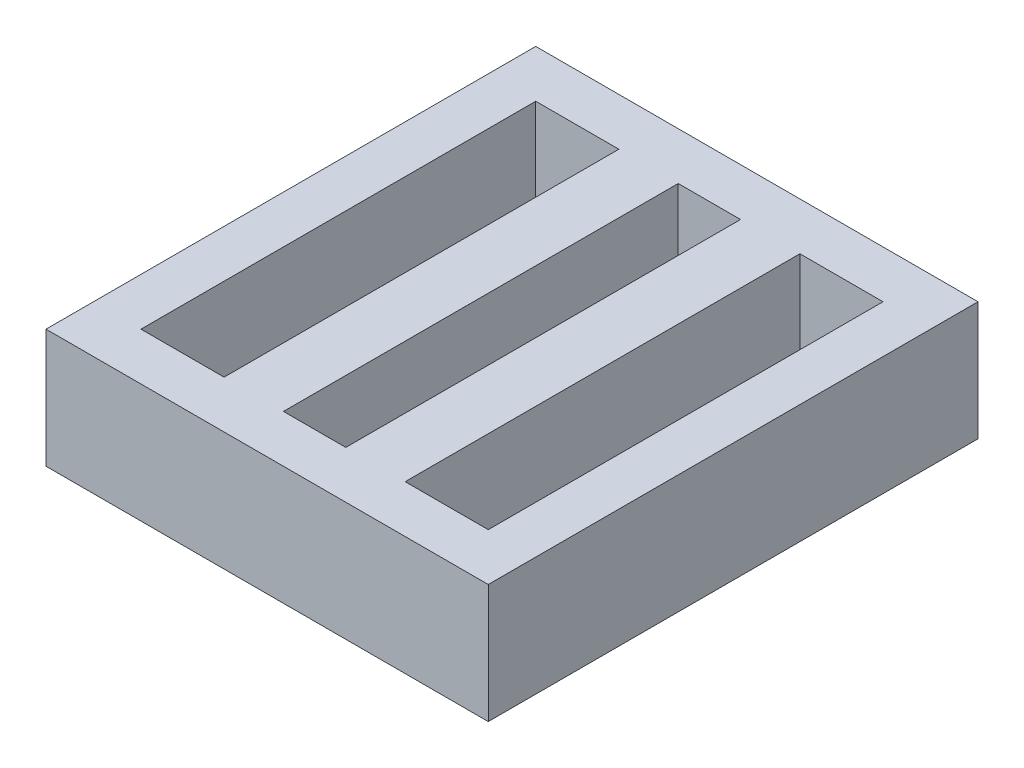
ISO-10303-21;
HEADER;
FILE_DESCRIPTION(('STEP AP214'),'2;1');
FILE_NAME('part.step','',(''),(''),'','','');
FILE_SCHEMA(('AUTOMOTIVE_DESIGN { 1 0 10303 214 1 1 1 1 }'));
ENDSEC;
DATA;
#1=APPLICATION_CONTEXT('core data for automotive mechanical design processes');
#2=APPLICATION_PROTOCOL_DEFINITION('international standard','automotive_design',2000,#1);
#3=PRODUCT_CONTEXT('',#1,'mechanical');
#4=PRODUCT('Part','Part','',(#3));
#5=PRODUCT_RELATED_PRODUCT_CATEGORY('part','',(#4));
#6=PRODUCT_DEFINITION_FORMATION('','',#4);
#7=PRODUCT_DEFINITION_CONTEXT('part definition',#1,'design');
#8=PRODUCT_DEFINITION('design','',#6,#7);
#9=PRODUCT_DEFINITION_SHAPE('','',#8);
#10=(LENGTH_UNIT() NAMED_UNIT(*) SI_UNIT(.MILLI.,.METRE.));
#11=(NAMED_UNIT(*) PLANE_ANGLE_UNIT() SI_UNIT($,.RADIAN.));
#12=(NAMED_UNIT(*) SI_UNIT($,.STERADIAN.) SOLID_ANGLE_UNIT());
#13=UNCERTAINTY_MEASURE_WITH_UNIT(LENGTH_MEASURE(1.E-05),#10,'distance_accuracy_value','');
#14=(GEOMETRIC_REPRESENTATION_CONTEXT(3) GLOBAL_UNCERTAINTY_ASSIGNED_CONTEXT((#13)) GLOBAL_UNIT_ASSIGNED_CONTEXT((#10,
#11,#12)) REPRESENTATION_CONTEXT('',''));
#15=CARTESIAN_POINT('',(0.,0.,0.));
#16=DIRECTION('',(0.,0.,1.));
#17=DIRECTION('',(1.,0.,0.));
#18=AXIS2_PLACEMENT_3D('',#15,#16,#17);
#19=CARTESIAN_POINT('',(0.,200.,0.));
#20=DIRECTION('',(0.,-1.,0.));
#21=DIRECTION('',(0.,0.,-1.));
#22=AXIS2_PLACEMENT_3D('',#19,#20,#21);
#23=PLANE('',#22);
#24=DIRECTION('',(0.,0.,-1.));
#25=VECTOR('',#24,1.);
#26=CARTESIAN_POINT('',(292.5,200.,-332.5));
#27=LINE('',#26,#25);
#28=CARTESIAN_POINT('',(292.5,200.,332.5));
#29=VERTEX_POINT('',#28);
#30=CARTESIAN_POINT('',(292.5,200.,-332.5));
#31=VERTEX_POINT('',#30);
#32=EDGE_CURVE('E209',#29,#31,#27,.T.);
#33=ORIENTED_EDGE('',*,*,#32,.F.);
#34=DIRECTION('',(1.,0.,0.));
#35=VECTOR('',#34,1.);
#36=CARTESIAN_POINT('',(292.5,200.,332.5));
#37=LINE('',#36,#35);
#38=CARTESIAN_POINT('',(152.5,200.,332.5));
#39=VERTEX_POINT('',#38);
#40=EDGE_CURVE('E216',#39,#29,#37,.T.);
#41=ORIENTED_EDGE('',*,*,#40,.F.);
#42=DIRECTION('',(0.,0.,1.));
#43=VECTOR('',#42,1.);
#44=CARTESIAN_POINT('',(152.5,200.,332.5));
#45=LINE('',#44,#43);
#46=CARTESIAN_POINT('',(152.5,200.,-332.5));
#47=VERTEX_POINT('',#46);
#48=EDGE_CURVE('E215',#47,#39,#45,.T.);
#49=ORIENTED_EDGE('',*,*,#48,.F.);
#50=DIRECTION('',(-1.,0.,0.));
#51=VECTOR('',#50,1.);
#52=CARTESIAN_POINT('',(292.5,200.,-332.5));
#53=LINE('',#52,#51);
#54=EDGE_CURVE('E208',#31,#47,#53,.T.);
#55=ORIENTED_EDGE('',*,*,#54,.F.);
#56=EDGE_LOOP('',(#33,#41,#49,#55));
#57=FACE_BOUND('',#56,.T.);
#58=DIRECTION('',(0.,0.,1.));
#59=VECTOR('',#58,1.);
#60=CARTESIAN_POINT('',(-372.5,200.,-412.5));
#61=LINE('',#60,#59);
#62=CARTESIAN_POINT('',(-372.5,200.,-412.5));
#63=VERTEX_POINT('',#62);
#64=CARTESIAN_POINT('',(-372.5,200.,412.5));
#65=VERTEX_POINT('',#64);
#66=EDGE_CURVE('E291',#63,#65,#61,.T.);
#67=ORIENTED_EDGE('',*,*,#66,.T.);
#68=DIRECTION('',(1.,0.,0.));
#69=VECTOR('',#68,1.);
#70=CARTESIAN_POINT('',(372.5,200.,412.5));
#71=LINE('',#70,#69);
#72=CARTESIAN_POINT('',(372.5,200.,412.5));
#73=VERTEX_POINT('',#72);
#74=EDGE_CURVE('E299',#65,#73,#71,.T.);
#75=ORIENTED_EDGE('',*,*,#74,.T.);
#76=DIRECTION('',(0.,0.,-1.));
#77=VECTOR('',#76,1.);
#78=CARTESIAN_POINT('',(372.5,200.,-412.5));
#79=LINE('',#78,#77);
#80=CARTESIAN_POINT('',(372.5,200.,-412.5));
#81=VERTEX_POINT('',#80);
#82=EDGE_CURVE('E303',#73,#81,#79,.T.);
#83=ORIENTED_EDGE('',*,*,#82,.T.);
#84=DIRECTION('',(-1.,0.,0.));
#85=VECTOR('',#84,1.);
#86=CARTESIAN_POINT('',(372.5,200.,-412.5));
#87=LINE('',#86,#85);
#88=EDGE_CURVE('E305',#81,#63,#87,.T.);
#89=ORIENTED_EDGE('',*,*,#88,.T.);
#90=EDGE_LOOP('',(#67,#75,#83,#89));
#91=FACE_BOUND('',#90,.T.);
#92=DIRECTION('',(-1.,0.,0.));
#93=VECTOR('',#92,1.);
#94=CARTESIAN_POINT('',(-152.5,200.,-332.5));
#95=LINE('',#94,#93);
#96=CARTESIAN_POINT('',(-152.5,200.,-332.5));
#97=VERTEX_POINT('',#96);
#98=CARTESIAN_POINT('',(-292.5,200.,-332.5));
#99=VERTEX_POINT('',#98);
#100=EDGE_CURVE('E248',#97,#99,#95,.T.);
#101=ORIENTED_EDGE('',*,*,#100,.F.);
#102=DIRECTION('',(0.,0.,-1.));
#103=VECTOR('',#102,1.);
#104=CARTESIAN_POINT('',(-152.5,200.,332.5));
#105=LINE('',#104,#103);
#106=CARTESIAN_POINT('',(-152.5,200.,332.5));
#107=VERTEX_POINT('',#106);
#108=EDGE_CURVE('E263',#107,#97,#105,.T.);
#109=ORIENTED_EDGE('',*,*,#108,.F.);
#110=DIRECTION('',(1.,0.,0.));
#111=VECTOR('',#110,1.);
#112=CARTESIAN_POINT('',(-152.5,200.,332.5));
#113=LINE('',#112,#111);
#114=CARTESIAN_POINT('',(-292.5,200.,332.5));
#115=VERTEX_POINT('',#114);
#116=EDGE_CURVE('E257',#115,#107,#113,.T.);
#117=ORIENTED_EDGE('',*,*,#116,.F.);
#118=DIRECTION('',(0.,0.,1.));
#119=VECTOR('',#118,1.);
#120=CARTESIAN_POINT('',(-292.5,200.,-332.5));
#121=LINE('',#120,#119);
#122=EDGE_CURVE('E255',#99,#115,#121,.T.);
#123=ORIENTED_EDGE('',*,*,#122,.F.);
#124=EDGE_LOOP('',(#101,#109,#117,#123));
#125=FACE_BOUND('',#124,.T.);
#126=DIRECTION('',(-1.,0.,0.));
#127=VECTOR('',#126,1.);
#128=CARTESIAN_POINT('',(52.5,200.,-332.5));
#129=LINE('',#128,#127);
#130=CARTESIAN_POINT('',(52.5,200.,-332.5));
#131=VERTEX_POINT('',#130);
#132=CARTESIAN_POINT('',(-52.4999999999999,200.,-332.5));
#133=VERTEX_POINT('',#132);
#134=EDGE_CURVE('E159',#131,#133,#129,.T.);
#135=ORIENTED_EDGE('',*,*,#134,.F.);
#136=DIRECTION('',(0.,0.,-1.));
#137=VECTOR('',#136,1.);
#138=CARTESIAN_POINT('',(52.5,200.,-332.5));
#139=LINE('',#138,#137);
#140=CARTESIAN_POINT('',(52.5000000000001,200.,332.5));
#141=VERTEX_POINT('',#140);
#142=EDGE_CURVE('E184',#141,#131,#139,.T.);
#143=ORIENTED_EDGE('',*,*,#142,.F.);
#144=DIRECTION('',(1.,0.,0.));
#145=VECTOR('',#144,1.);
#146=CARTESIAN_POINT('',(52.5000000000001,200.,332.5));
#147=LINE('',#146,#145);
#148=CARTESIAN_POINT('',(-52.4999999999999,200.,332.5));
#149=VERTEX_POINT('',#148);
#150=EDGE_CURVE('E181',#149,#141,#147,.T.);
#151=ORIENTED_EDGE('',*,*,#150,.F.);
#152=DIRECTION('',(0.,0.,1.));
#153=VECTOR('',#152,1.);
#154=CARTESIAN_POINT('',(-52.4999999999999,200.,-332.5));
#155=LINE('',#154,#153);
#156=EDGE_CURVE('E166',#133,#149,#155,.T.);
#157=ORIENTED_EDGE('',*,*,#156,.F.);
#158=EDGE_LOOP('',(#135,#143,#151,#157));
#159=FACE_BOUND('',#158,.T.);
#160=ADVANCED_FACE('F44',(#57,#91,#125,#159),#23,.F.);
#161=CARTESIAN_POINT('',(0.,0.,0.));
#162=DIRECTION('',(0.,-1.,0.));
#163=DIRECTION('',(0.,0.,-1.));
#164=AXIS2_PLACEMENT_3D('',#161,#162,#163);
#165=PLANE('',#164);
#166=DIRECTION('',(0.,0.,1.));
#167=VECTOR('',#166,1.);
#168=CARTESIAN_POINT('',(-372.5,0.,-412.5));
#169=LINE('',#168,#167);
#170=CARTESIAN_POINT('',(-372.5,0.,-412.5));
#171=VERTEX_POINT('',#170);
#172=CARTESIAN_POINT('',(-372.5,0.,412.5));
#173=VERTEX_POINT('',#172);
#174=EDGE_CURVE('E295',#171,#173,#169,.T.);
#175=ORIENTED_EDGE('',*,*,#174,.F.);
#176=DIRECTION('',(-1.,0.,0.));
#177=VECTOR('',#176,1.);
#178=CARTESIAN_POINT('',(372.5,0.,-412.5));
#179=LINE('',#178,#177);
#180=CARTESIAN_POINT('',(372.5,0.,-412.5));
#181=VERTEX_POINT('',#180);
#182=EDGE_CURVE('E300',#181,#171,#179,.T.);
#183=ORIENTED_EDGE('',*,*,#182,.F.);
#184=DIRECTION('',(0.,0.,-1.));
#185=VECTOR('',#184,1.);
#186=CARTESIAN_POINT('',(372.5,0.,-412.5));
#187=LINE('',#186,#185);
#188=CARTESIAN_POINT('',(372.5,0.,412.5));
#189=VERTEX_POINT('',#188);
#190=EDGE_CURVE('E312',#189,#181,#187,.T.);
#191=ORIENTED_EDGE('',*,*,#190,.F.);
#192=DIRECTION('',(1.,0.,0.));
#193=VECTOR('',#192,1.);
#194=CARTESIAN_POINT('',(372.5,0.,412.5));
#195=LINE('',#194,#193);
#196=EDGE_CURVE('E311',#173,#189,#195,.T.);
#197=ORIENTED_EDGE('',*,*,#196,.F.);
#198=EDGE_LOOP('',(#175,#183,#191,#197));
#199=FACE_BOUND('',#198,.T.);
#200=DIRECTION('',(0.,0.,-1.));
#201=VECTOR('',#200,1.);
#202=CARTESIAN_POINT('',(-152.5,0.,332.5));
#203=LINE('',#202,#201);
#204=CARTESIAN_POINT('',(-152.5,0.,332.5));
#205=VERTEX_POINT('',#204);
#206=CARTESIAN_POINT('',(-152.5,0.,-332.5));
#207=VERTEX_POINT('',#206);
#208=EDGE_CURVE('E251',#205,#207,#203,.T.);
#209=ORIENTED_EDGE('',*,*,#208,.T.);
#210=DIRECTION('',(-1.,0.,0.));
#211=VECTOR('',#210,1.);
#212=CARTESIAN_POINT('',(-152.5,0.,-332.5));
#213=LINE('',#212,#211);
#214=CARTESIAN_POINT('',(-292.5,0.,-332.5));
#215=VERTEX_POINT('',#214);
#216=EDGE_CURVE('E249',#207,#215,#213,.T.);
#217=ORIENTED_EDGE('',*,*,#216,.T.);
#218=DIRECTION('',(0.,0.,1.));
#219=VECTOR('',#218,1.);
#220=CARTESIAN_POINT('',(-292.5,0.,-332.5));
#221=LINE('',#220,#219);
#222=CARTESIAN_POINT('',(-292.5,0.,332.5));
#223=VERTEX_POINT('',#222);
#224=EDGE_CURVE('E268',#215,#223,#221,.T.);
#225=ORIENTED_EDGE('',*,*,#224,.T.);
#226=DIRECTION('',(1.,0.,0.));
#227=VECTOR('',#226,1.);
#228=CARTESIAN_POINT('',(-152.5,0.,332.5));
#229=LINE('',#228,#227);
#230=EDGE_CURVE('E275',#223,#205,#229,.T.);
#231=ORIENTED_EDGE('',*,*,#230,.T.);
#232=EDGE_LOOP('',(#209,#217,#225,#231));
#233=FACE_BOUND('',#232,.T.);
#234=DIRECTION('',(1.,0.,0.));
#235=VECTOR('',#234,1.);
#236=CARTESIAN_POINT('',(292.5,0.,332.5));
#237=LINE('',#236,#235);
#238=CARTESIAN_POINT('',(152.5,0.,332.5));
#239=VERTEX_POINT('',#238);
#240=CARTESIAN_POINT('',(292.5,0.,332.5));
#241=VERTEX_POINT('',#240);
#242=EDGE_CURVE('E213',#239,#241,#237,.T.);
#243=ORIENTED_EDGE('',*,*,#242,.T.);
#244=DIRECTION('',(0.,0.,-1.));
#245=VECTOR('',#244,1.);
#246=CARTESIAN_POINT('',(292.5,0.,-332.5));
#247=LINE('',#246,#245);
#248=CARTESIAN_POINT('',(292.5,0.,-332.5));
#249=VERTEX_POINT('',#248);
#250=EDGE_CURVE('E180',#241,#249,#247,.T.);
#251=ORIENTED_EDGE('',*,*,#250,.T.);
#252=DIRECTION('',(-1.,0.,0.));
#253=VECTOR('',#252,1.);
#254=CARTESIAN_POINT('',(292.5,0.,-332.5));
#255=LINE('',#254,#253);
#256=CARTESIAN_POINT('',(152.5,0.,-332.5));
#257=VERTEX_POINT('',#256);
#258=EDGE_CURVE('E224',#249,#257,#255,.T.);
#259=ORIENTED_EDGE('',*,*,#258,.T.);
#260=DIRECTION('',(0.,0.,1.));
#261=VECTOR('',#260,1.);
#262=CARTESIAN_POINT('',(152.5,0.,332.5));
#263=LINE('',#262,#261);
#264=EDGE_CURVE('E227',#257,#239,#263,.T.);
#265=ORIENTED_EDGE('',*,*,#264,.T.);
#266=EDGE_LOOP('',(#243,#251,#259,#265));
#267=FACE_BOUND('',#266,.T.);
#268=DIRECTION('',(0.,0.,-1.));
#269=VECTOR('',#268,1.);
#270=CARTESIAN_POINT('',(52.5,0.,-332.5));
#271=LINE('',#270,#269);
#272=CARTESIAN_POINT('',(52.5000000000001,0.,332.5));
#273=VERTEX_POINT('',#272);
#274=CARTESIAN_POINT('',(52.5,0.,-332.5));
#275=VERTEX_POINT('',#274);
#276=EDGE_CURVE('E170',#273,#275,#271,.T.);
#277=ORIENTED_EDGE('',*,*,#276,.T.);
#278=DIRECTION('',(-1.,0.,0.));
#279=VECTOR('',#278,1.);
#280=CARTESIAN_POINT('',(52.5,0.,-332.5));
#281=LINE('',#280,#279);
#282=CARTESIAN_POINT('',(-52.4999999999999,0.,-332.5));
#283=VERTEX_POINT('',#282);
#284=EDGE_CURVE('E69',#275,#283,#281,.T.);
#285=ORIENTED_EDGE('',*,*,#284,.T.);
#286=DIRECTION('',(0.,0.,1.));
#287=VECTOR('',#286,1.);
#288=CARTESIAN_POINT('',(-52.4999999999999,0.,-332.5));
#289=LINE('',#288,#287);
#290=CARTESIAN_POINT('',(-52.4999999999999,0.,332.5));
#291=VERTEX_POINT('',#290);
#292=EDGE_CURVE('E172',#283,#291,#289,.T.);
#293=ORIENTED_EDGE('',*,*,#292,.T.);
#294=DIRECTION('',(1.,0.,0.));
#295=VECTOR('',#294,1.);
#296=CARTESIAN_POINT('',(52.5000000000001,0.,332.5));
#297=LINE('',#296,#295);
#298=EDGE_CURVE('E191',#291,#273,#297,.T.);
#299=ORIENTED_EDGE('',*,*,#298,.T.);
#300=EDGE_LOOP('',(#277,#285,#293,#299));
#301=FACE_BOUND('',#300,.T.);
#302=ADVANCED_FACE('F340',(#199,#233,#267,#301),#165,.T.);
#303=CARTESIAN_POINT('',(-372.5,200.,-412.5));
#304=DIRECTION('',(1.,0.,0.));
#305=DIRECTION('',(0.,0.,-1.));
#306=AXIS2_PLACEMENT_3D('',#303,#304,#305);
#307=PLANE('',#306);
#308=ORIENTED_EDGE('',*,*,#174,.T.);
#309=DIRECTION('',(0.,-1.,0.));
#310=VECTOR('',#309,1.);
#311=CARTESIAN_POINT('',(-372.5,200.,412.5));
#312=LINE('',#311,#310);
#313=EDGE_CURVE('E11',#65,#173,#312,.T.);
#314=ORIENTED_EDGE('',*,*,#313,.F.);
#315=ORIENTED_EDGE('',*,*,#66,.F.);
#316=DIRECTION('',(0.,-1.,0.));
#317=VECTOR('',#316,1.);
#318=CARTESIAN_POINT('',(-372.5,200.,-412.5));
#319=LINE('',#318,#317);
#320=EDGE_CURVE('E310',#63,#171,#319,.T.);
#321=ORIENTED_EDGE('',*,*,#320,.T.);
#322=EDGE_LOOP('',(#308,#314,#315,#321));
#323=FACE_BOUND('',#322,.T.);
#324=ADVANCED_FACE('F50',(#323),#307,.F.);
#325=CARTESIAN_POINT('',(372.5,200.,412.5));
#326=DIRECTION('',(0.,0.,-1.));
#327=DIRECTION('',(-1.,0.,0.));
#328=AXIS2_PLACEMENT_3D('',#325,#326,#327);
#329=PLANE('',#328);
#330=ORIENTED_EDGE('',*,*,#196,.T.);
#331=DIRECTION('',(0.,-1.,0.));
#332=VECTOR('',#331,1.);
#333=CARTESIAN_POINT('',(372.5,200.,412.5));
#334=LINE('',#333,#332);
#335=EDGE_CURVE('E53',#73,#189,#334,.T.);
#336=ORIENTED_EDGE('',*,*,#335,.F.);
#337=ORIENTED_EDGE('',*,*,#74,.F.);
#338=ORIENTED_EDGE('',*,*,#313,.T.);
#339=EDGE_LOOP('',(#330,#336,#337,#338));
#340=FACE_BOUND('',#339,.T.);
#341=ADVANCED_FACE('F346',(#340),#329,.F.);
#342=CARTESIAN_POINT('',(372.5,200.,-412.5));
#343=DIRECTION('',(-1.,0.,0.));
#344=DIRECTION('',(0.,0.,1.));
#345=AXIS2_PLACEMENT_3D('',#342,#343,#344);
#346=PLANE('',#345);
#347=ORIENTED_EDGE('',*,*,#190,.T.);
#348=DIRECTION('',(0.,-1.,0.));
#349=VECTOR('',#348,1.);
#350=CARTESIAN_POINT('',(372.5,200.,-412.5));
#351=LINE('',#350,#349);
#352=EDGE_CURVE('E325',#81,#181,#351,.T.);
#353=ORIENTED_EDGE('',*,*,#352,.F.);
#354=ORIENTED_EDGE('',*,*,#82,.F.);
#355=ORIENTED_EDGE('',*,*,#335,.T.);
#356=EDGE_LOOP('',(#347,#353,#354,#355));
#357=FACE_BOUND('',#356,.T.);
#358=ADVANCED_FACE('F332',(#357),#346,.F.);
#359=CARTESIAN_POINT('',(372.5,200.,-412.5));
#360=DIRECTION('',(0.,0.,1.));
#361=DIRECTION('',(1.,0.,0.));
#362=AXIS2_PLACEMENT_3D('',#359,#360,#361);
#363=PLANE('',#362);
#364=ORIENTED_EDGE('',*,*,#182,.T.);
#365=ORIENTED_EDGE('',*,*,#320,.F.);
#366=ORIENTED_EDGE('',*,*,#88,.F.);
#367=ORIENTED_EDGE('',*,*,#352,.T.);
#368=EDGE_LOOP('',(#364,#365,#366,#367));
#369=FACE_BOUND('',#368,.T.);
#370=ADVANCED_FACE('F342',(#369),#363,.F.);
#371=CARTESIAN_POINT('',(-152.5,200.,-332.5));
#372=DIRECTION('',(0.,0.,1.));
#373=DIRECTION('',(1.,0.,0.));
#374=AXIS2_PLACEMENT_3D('',#371,#372,#373);
#375=PLANE('',#374);
#376=ORIENTED_EDGE('',*,*,#216,.F.);
#377=DIRECTION('',(0.,-1.,0.));
#378=VECTOR('',#377,1.);
#379=CARTESIAN_POINT('',(-152.5,200.,-332.5));
#380=LINE('',#379,#378);
#381=EDGE_CURVE('E264',#97,#207,#380,.T.);
#382=ORIENTED_EDGE('',*,*,#381,.F.);
#383=ORIENTED_EDGE('',*,*,#100,.T.);
#384=DIRECTION('',(0.,-1.,0.));
#385=VECTOR('',#384,1.);
#386=CARTESIAN_POINT('',(-292.5,200.,-332.5));
#387=LINE('',#386,#385);
#388=EDGE_CURVE('E290',#99,#215,#387,.T.);
#389=ORIENTED_EDGE('',*,*,#388,.T.);
#390=EDGE_LOOP('',(#376,#382,#383,#389));
#391=FACE_BOUND('',#390,.T.);
#392=ADVANCED_FACE('F362',(#391),#375,.T.);
#393=CARTESIAN_POINT('',(-292.5,200.,-332.5));
#394=DIRECTION('',(1.,0.,0.));
#395=DIRECTION('',(0.,0.,-1.));
#396=AXIS2_PLACEMENT_3D('',#393,#394,#395);
#397=PLANE('',#396);
#398=ORIENTED_EDGE('',*,*,#224,.F.);
#399=ORIENTED_EDGE('',*,*,#388,.F.);
#400=ORIENTED_EDGE('',*,*,#122,.T.);
#401=DIRECTION('',(0.,-1.,0.));
#402=VECTOR('',#401,1.);
#403=CARTESIAN_POINT('',(-292.5,200.,332.5));
#404=LINE('',#403,#402);
#405=EDGE_CURVE('E283',#115,#223,#404,.T.);
#406=ORIENTED_EDGE('',*,*,#405,.T.);
#407=EDGE_LOOP('',(#398,#399,#400,#406));
#408=FACE_BOUND('',#407,.T.);
#409=ADVANCED_FACE('F372',(#408),#397,.T.);
#410=CARTESIAN_POINT('',(-152.5,200.,332.5));
#411=DIRECTION('',(0.,0.,-1.));
#412=DIRECTION('',(-1.,0.,0.));
#413=AXIS2_PLACEMENT_3D('',#410,#411,#412);
#414=PLANE('',#413);
#415=ORIENTED_EDGE('',*,*,#230,.F.);
#416=ORIENTED_EDGE('',*,*,#405,.F.);
#417=ORIENTED_EDGE('',*,*,#116,.T.);
#418=DIRECTION('',(0.,-1.,0.));
#419=VECTOR('',#418,1.);
#420=CARTESIAN_POINT('',(-152.5,200.,332.5));
#421=LINE('',#420,#419);
#422=EDGE_CURVE('E285',#107,#205,#421,.T.);
#423=ORIENTED_EDGE('',*,*,#422,.T.);
#424=EDGE_LOOP('',(#415,#416,#417,#423));
#425=FACE_BOUND('',#424,.T.);
#426=ADVANCED_FACE('F377',(#425),#414,.T.);
#427=CARTESIAN_POINT('',(-152.5,200.,332.5));
#428=DIRECTION('',(-1.,0.,0.));
#429=DIRECTION('',(0.,0.,1.));
#430=AXIS2_PLACEMENT_3D('',#427,#428,#429);
#431=PLANE('',#430);
#432=ORIENTED_EDGE('',*,*,#208,.F.);
#433=ORIENTED_EDGE('',*,*,#422,.F.);
#434=ORIENTED_EDGE('',*,*,#108,.T.);
#435=ORIENTED_EDGE('',*,*,#381,.T.);
#436=EDGE_LOOP('',(#432,#433,#434,#435));
#437=FACE_BOUND('',#436,.T.);
#438=ADVANCED_FACE('F381',(#437),#431,.T.);
#439=CARTESIAN_POINT('',(292.5,200.,-332.5));
#440=DIRECTION('',(-1.,0.,0.));
#441=DIRECTION('',(0.,0.,1.));
#442=AXIS2_PLACEMENT_3D('',#439,#440,#441);
#443=PLANE('',#442);
#444=ORIENTED_EDGE('',*,*,#250,.F.);
#445=DIRECTION('',(0.,-1.,0.));
#446=VECTOR('',#445,1.);
#447=CARTESIAN_POINT('',(292.5,200.,332.5));
#448=LINE('',#447,#446);
#449=EDGE_CURVE('E221',#29,#241,#448,.T.);
#450=ORIENTED_EDGE('',*,*,#449,.F.);
#451=ORIENTED_EDGE('',*,*,#32,.T.);
#452=DIRECTION('',(0.,-1.,0.));
#453=VECTOR('',#452,1.);
#454=CARTESIAN_POINT('',(292.5,200.,-332.5));
#455=LINE('',#454,#453);
#456=EDGE_CURVE('E243',#31,#249,#455,.T.);
#457=ORIENTED_EDGE('',*,*,#456,.T.);
#458=EDGE_LOOP('',(#444,#450,#451,#457));
#459=FACE_BOUND('',#458,.T.);
#460=ADVANCED_FACE('F398',(#459),#443,.T.);
#461=CARTESIAN_POINT('',(292.5,200.,-332.5));
#462=DIRECTION('',(0.,0.,1.));
#463=DIRECTION('',(1.,0.,0.));
#464=AXIS2_PLACEMENT_3D('',#461,#462,#463);
#465=PLANE('',#464);
#466=ORIENTED_EDGE('',*,*,#258,.F.);
#467=ORIENTED_EDGE('',*,*,#456,.F.);
#468=ORIENTED_EDGE('',*,*,#54,.T.);
#469=DIRECTION('',(0.,-1.,0.));
#470=VECTOR('',#469,1.);
#471=CARTESIAN_POINT('',(152.5,200.,-332.5));
#472=LINE('',#471,#470);
#473=EDGE_CURVE('E244',#47,#257,#472,.T.);
#474=ORIENTED_EDGE('',*,*,#473,.T.);
#475=EDGE_LOOP('',(#466,#467,#468,#474));
#476=FACE_BOUND('',#475,.T.);
#477=ADVANCED_FACE('F401',(#476),#465,.T.);
#478=CARTESIAN_POINT('',(152.5,200.,332.5));
#479=DIRECTION('',(1.,0.,0.));
#480=DIRECTION('',(0.,0.,-1.));
#481=AXIS2_PLACEMENT_3D('',#478,#479,#480);
#482=PLANE('',#481);
#483=ORIENTED_EDGE('',*,*,#264,.F.);
#484=ORIENTED_EDGE('',*,*,#473,.F.);
#485=ORIENTED_EDGE('',*,*,#48,.T.);
#486=DIRECTION('',(0.,-1.,0.));
#487=VECTOR('',#486,1.);
#488=CARTESIAN_POINT('',(152.5,200.,332.5));
#489=LINE('',#488,#487);
#490=EDGE_CURVE('E236',#39,#239,#489,.T.);
#491=ORIENTED_EDGE('',*,*,#490,.T.);
#492=EDGE_LOOP('',(#483,#484,#485,#491));
#493=FACE_BOUND('',#492,.T.);
#494=ADVANCED_FACE('F404',(#493),#482,.T.);
#495=CARTESIAN_POINT('',(292.5,200.,332.5));
#496=DIRECTION('',(0.,0.,-1.));
#497=DIRECTION('',(-1.,0.,0.));
#498=AXIS2_PLACEMENT_3D('',#495,#496,#497);
#499=PLANE('',#498);
#500=ORIENTED_EDGE('',*,*,#242,.F.);
#501=ORIENTED_EDGE('',*,*,#490,.F.);
#502=ORIENTED_EDGE('',*,*,#40,.T.);
#503=ORIENTED_EDGE('',*,*,#449,.T.);
#504=EDGE_LOOP('',(#500,#501,#502,#503));
#505=FACE_BOUND('',#504,.T.);
#506=ADVANCED_FACE('F407',(#505),#499,.T.);
#507=CARTESIAN_POINT('',(52.5,200.,-332.5));
#508=DIRECTION('',(0.,0.,1.));
#509=DIRECTION('',(1.,0.,0.));
#510=AXIS2_PLACEMENT_3D('',#507,#508,#509);
#511=PLANE('',#510);
#512=ORIENTED_EDGE('',*,*,#284,.F.);
#513=DIRECTION('',(0.,-1.,0.));
#514=VECTOR('',#513,1.);
#515=CARTESIAN_POINT('',(52.5,200.,-332.5));
#516=LINE('',#515,#514);
#517=EDGE_CURVE('E165',#131,#275,#516,.T.);
#518=ORIENTED_EDGE('',*,*,#517,.F.);
#519=ORIENTED_EDGE('',*,*,#134,.T.);
#520=DIRECTION('',(0.,-1.,0.));
#521=VECTOR('',#520,1.);
#522=CARTESIAN_POINT('',(-52.4999999999999,200.,-332.5));
#523=LINE('',#522,#521);
#524=EDGE_CURVE('E164',#133,#283,#523,.T.);
#525=ORIENTED_EDGE('',*,*,#524,.T.);
#526=EDGE_LOOP('',(#512,#518,#519,#525));
#527=FACE_BOUND('',#526,.T.);
#528=ADVANCED_FACE('F162',(#527),#511,.T.);
#529=CARTESIAN_POINT('',(-52.4999999999999,200.,-332.5));
#530=DIRECTION('',(1.,0.,0.));
#531=DIRECTION('',(0.,0.,-1.));
#532=AXIS2_PLACEMENT_3D('',#529,#530,#531);
#533=PLANE('',#532);
#534=ORIENTED_EDGE('',*,*,#292,.F.);
#535=ORIENTED_EDGE('',*,*,#524,.F.);
#536=ORIENTED_EDGE('',*,*,#156,.T.);
#537=DIRECTION('',(0.,-1.,0.));
#538=VECTOR('',#537,1.);
#539=CARTESIAN_POINT('',(-52.4999999999999,200.,332.5));
#540=LINE('',#539,#538);
#541=EDGE_CURVE('E178',#149,#291,#540,.T.);
#542=ORIENTED_EDGE('',*,*,#541,.T.);
#543=EDGE_LOOP('',(#534,#535,#536,#542));
#544=FACE_BOUND('',#543,.T.);
#545=ADVANCED_FACE('F175',(#544),#533,.T.);
#546=CARTESIAN_POINT('',(52.5000000000001,200.,332.5));
#547=DIRECTION('',(0.,0.,-1.));
#548=DIRECTION('',(-1.,0.,0.));
#549=AXIS2_PLACEMENT_3D('',#546,#547,#548);
#550=PLANE('',#549);
#551=ORIENTED_EDGE('',*,*,#298,.F.);
#552=ORIENTED_EDGE('',*,*,#541,.F.);
#553=ORIENTED_EDGE('',*,*,#150,.T.);
#554=DIRECTION('',(0.,-1.,0.));
#555=VECTOR('',#554,1.);
#556=CARTESIAN_POINT('',(52.5000000000001,200.,332.5));
#557=LINE('',#556,#555);
#558=EDGE_CURVE('E62',#141,#273,#557,.T.);
#559=ORIENTED_EDGE('',*,*,#558,.T.);
#560=EDGE_LOOP('',(#551,#552,#553,#559));
#561=FACE_BOUND('',#560,.T.);
#562=ADVANCED_FACE('F419',(#561),#550,.T.);
#563=CARTESIAN_POINT('',(52.5,200.,-332.5));
#564=DIRECTION('',(-1.,0.,0.));
#565=DIRECTION('',(0.,0.,1.));
#566=AXIS2_PLACEMENT_3D('',#563,#564,#565);
#567=PLANE('',#566);
#568=ORIENTED_EDGE('',*,*,#276,.F.);
#569=ORIENTED_EDGE('',*,*,#558,.F.);
#570=ORIENTED_EDGE('',*,*,#142,.T.);
#571=ORIENTED_EDGE('',*,*,#517,.T.);
#572=EDGE_LOOP('',(#568,#569,#570,#571));
#573=FACE_BOUND('',#572,.T.);
#574=ADVANCED_FACE('F422',(#573),#567,.T.);
#575=CLOSED_SHELL('',(#160,#302,#324,#341,#358,#370,#392,#409,#426,#438,#460,#477,#494,#506,
#528,#545,#562,#574));
#576=MANIFOLD_SOLID_BREP('B2',#575);
#577=ADVANCED_BREP_SHAPE_REPRESENTATION('',(#18,#576),#14);
#578=SHAPE_DEFINITION_REPRESENTATION(#9,#577);
ENDSEC;
END-ISO-10303-21;
